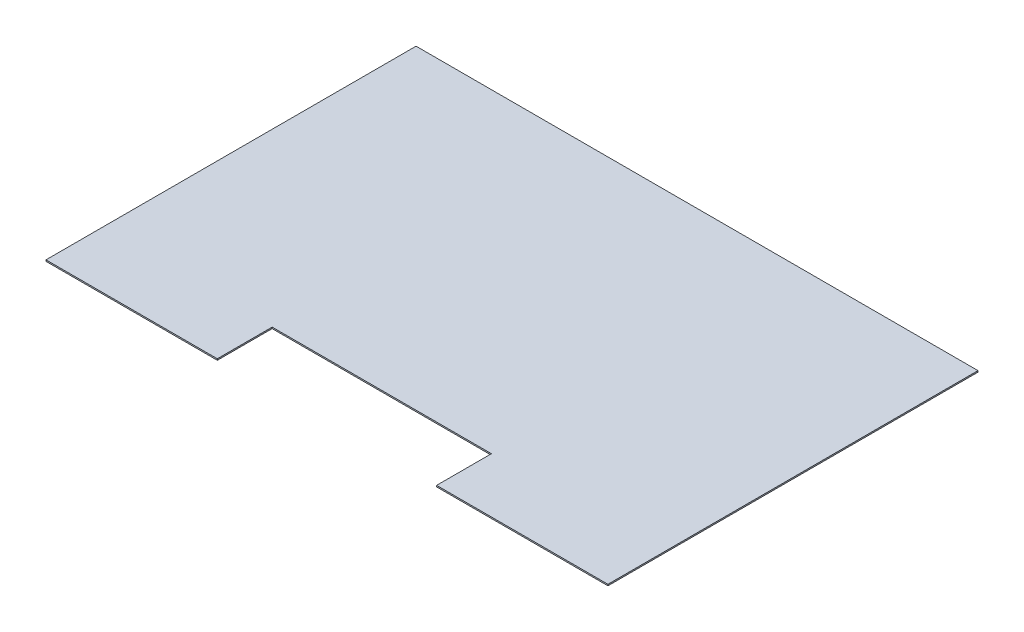
ISO-10303-21;
HEADER;
FILE_DESCRIPTION(('STEP AP214'),'2;1');
FILE_NAME('part.step','',(''),(''),'','','');
FILE_SCHEMA(('AUTOMOTIVE_DESIGN { 1 0 10303 214 1 1 1 1 }'));
ENDSEC;
DATA;
#1=APPLICATION_CONTEXT('core data for automotive mechanical design processes');
#2=APPLICATION_PROTOCOL_DEFINITION('international standard','automotive_design',2000,#1);
#3=PRODUCT_CONTEXT('',#1,'mechanical');
#4=PRODUCT('Part','Part','',(#3));
#5=PRODUCT_RELATED_PRODUCT_CATEGORY('part','',(#4));
#6=PRODUCT_DEFINITION_FORMATION('','',#4);
#7=PRODUCT_DEFINITION_CONTEXT('part definition',#1,'design');
#8=PRODUCT_DEFINITION('design','',#6,#7);
#9=PRODUCT_DEFINITION_SHAPE('','',#8);
#10=(LENGTH_UNIT() NAMED_UNIT(*) SI_UNIT(.MILLI.,.METRE.));
#11=(NAMED_UNIT(*) PLANE_ANGLE_UNIT() SI_UNIT($,.RADIAN.));
#12=(NAMED_UNIT(*) SI_UNIT($,.STERADIAN.) SOLID_ANGLE_UNIT());
#13=UNCERTAINTY_MEASURE_WITH_UNIT(LENGTH_MEASURE(1.E-05),#10,'distance_accuracy_value','');
#14=(GEOMETRIC_REPRESENTATION_CONTEXT(3) GLOBAL_UNCERTAINTY_ASSIGNED_CONTEXT((#13)) GLOBAL_UNIT_ASSIGNED_CONTEXT((#10,
#11,#12)) REPRESENTATION_CONTEXT('',''));
#15=CARTESIAN_POINT('',(0.,0.,0.));
#16=DIRECTION('',(0.,0.,1.));
#17=DIRECTION('',(1.,0.,0.));
#18=AXIS2_PLACEMENT_3D('',#15,#16,#17);
#19=CARTESIAN_POINT('',(80.,1.,0.));
#20=DIRECTION('',(-1.,0.,0.));
#21=DIRECTION('',(0.,0.,1.));
#22=AXIS2_PLACEMENT_3D('',#19,#20,#21);
#23=PLANE('',#22);
#24=DIRECTION('',(0.,0.,-1.));
#25=VECTOR('',#24,1.);
#26=CARTESIAN_POINT('',(80.,0.,0.));
#27=LINE('',#26,#25);
#28=CARTESIAN_POINT('',(80.,0.,135.));
#29=VERTEX_POINT('',#28);
#30=CARTESIAN_POINT('',(80.,0.,95.));
#31=VERTEX_POINT('',#30);
#32=EDGE_CURVE('E146',#29,#31,#27,.T.);
#33=ORIENTED_EDGE('',*,*,#32,.F.);
#34=DIRECTION('',(0.,-1.,0.));
#35=VECTOR('',#34,1.);
#36=CARTESIAN_POINT('',(80.,1.,135.));
#37=LINE('',#36,#35);
#38=CARTESIAN_POINT('',(80.,1.,135.));
#39=VERTEX_POINT('',#38);
#40=EDGE_CURVE('E11',#39,#29,#37,.T.);
#41=ORIENTED_EDGE('',*,*,#40,.F.);
#42=DIRECTION('',(0.,0.,-1.));
#43=VECTOR('',#42,1.);
#44=CARTESIAN_POINT('',(80.,1.,0.));
#45=LINE('',#44,#43);
#46=CARTESIAN_POINT('',(80.,1.,95.));
#47=VERTEX_POINT('',#46);
#48=EDGE_CURVE('E170',#39,#47,#45,.T.);
#49=ORIENTED_EDGE('',*,*,#48,.T.);
#50=DIRECTION('',(0.,-1.,0.));
#51=VECTOR('',#50,1.);
#52=CARTESIAN_POINT('',(80.,1.,95.));
#53=LINE('',#52,#51);
#54=EDGE_CURVE('E97',#47,#31,#53,.T.);
#55=ORIENTED_EDGE('',*,*,#54,.T.);
#56=EDGE_LOOP('',(#33,#41,#49,#55));
#57=FACE_BOUND('',#56,.T.);
#58=ADVANCED_FACE('F45',(#57),#23,.T.);
#59=CARTESIAN_POINT('',(0.,1.,135.));
#60=DIRECTION('',(0.,0.,-1.));
#61=DIRECTION('',(-1.,0.,0.));
#62=AXIS2_PLACEMENT_3D('',#59,#60,#61);
#63=PLANE('',#62);
#64=DIRECTION('',(1.,0.,0.));
#65=VECTOR('',#64,1.);
#66=CARTESIAN_POINT('',(0.,0.,135.));
#67=LINE('',#66,#65);
#68=CARTESIAN_POINT('',(205.,0.,135.));
#69=VERTEX_POINT('',#68);
#70=EDGE_CURVE('E150',#29,#69,#67,.T.);
#71=ORIENTED_EDGE('',*,*,#70,.T.);
#72=DIRECTION('',(0.,-1.,0.));
#73=VECTOR('',#72,1.);
#74=CARTESIAN_POINT('',(205.,1.,135.));
#75=LINE('',#74,#73);
#76=CARTESIAN_POINT('',(205.,1.,135.));
#77=VERTEX_POINT('',#76);
#78=EDGE_CURVE('E54',#77,#69,#75,.T.);
#79=ORIENTED_EDGE('',*,*,#78,.F.);
#80=DIRECTION('',(1.,0.,0.));
#81=VECTOR('',#80,1.);
#82=CARTESIAN_POINT('',(0.,1.,135.));
#83=LINE('',#82,#81);
#84=EDGE_CURVE('E129',#39,#77,#83,.T.);
#85=ORIENTED_EDGE('',*,*,#84,.F.);
#86=ORIENTED_EDGE('',*,*,#40,.T.);
#87=EDGE_LOOP('',(#71,#79,#85,#86));
#88=FACE_BOUND('',#87,.T.);
#89=ADVANCED_FACE('F192',(#88),#63,.F.);
#90=CARTESIAN_POINT('',(205.,1.,0.));
#91=DIRECTION('',(1.,0.,0.));
#92=DIRECTION('',(0.,0.,-1.));
#93=AXIS2_PLACEMENT_3D('',#90,#91,#92);
#94=PLANE('',#93);
#95=DIRECTION('',(0.,0.,1.));
#96=VECTOR('',#95,1.);
#97=CARTESIAN_POINT('',(205.,0.,0.));
#98=LINE('',#97,#96);
#99=CARTESIAN_POINT('',(205.,0.,-135.));
#100=VERTEX_POINT('',#99);
#101=EDGE_CURVE('E154',#100,#69,#98,.T.);
#102=ORIENTED_EDGE('',*,*,#101,.F.);
#103=DIRECTION('',(0.,-1.,0.));
#104=VECTOR('',#103,1.);
#105=CARTESIAN_POINT('',(205.,1.,-135.));
#106=LINE('',#105,#104);
#107=CARTESIAN_POINT('',(205.,1.,-135.));
#108=VERTEX_POINT('',#107);
#109=EDGE_CURVE('E180',#108,#100,#106,.T.);
#110=ORIENTED_EDGE('',*,*,#109,.F.);
#111=DIRECTION('',(0.,0.,1.));
#112=VECTOR('',#111,1.);
#113=CARTESIAN_POINT('',(205.,1.,0.));
#114=LINE('',#113,#112);
#115=EDGE_CURVE('E189',#108,#77,#114,.T.);
#116=ORIENTED_EDGE('',*,*,#115,.T.);
#117=ORIENTED_EDGE('',*,*,#78,.T.);
#118=EDGE_LOOP('',(#102,#110,#116,#117));
#119=FACE_BOUND('',#118,.T.);
#120=ADVANCED_FACE('F187',(#119),#94,.T.);
#121=CARTESIAN_POINT('',(0.,1.,-135.));
#122=DIRECTION('',(0.,0.,-1.));
#123=DIRECTION('',(-1.,0.,0.));
#124=AXIS2_PLACEMENT_3D('',#121,#122,#123);
#125=PLANE('',#124);
#126=DIRECTION('',(1.,0.,0.));
#127=VECTOR('',#126,1.);
#128=CARTESIAN_POINT('',(0.,0.,-135.));
#129=LINE('',#128,#127);
#130=CARTESIAN_POINT('',(-205.,0.,-135.));
#131=VERTEX_POINT('',#130);
#132=EDGE_CURVE('E158',#131,#100,#129,.T.);
#133=ORIENTED_EDGE('',*,*,#132,.F.);
#134=DIRECTION('',(0.,-1.,0.));
#135=VECTOR('',#134,1.);
#136=CARTESIAN_POINT('',(-205.,1.,-135.));
#137=LINE('',#136,#135);
#138=CARTESIAN_POINT('',(-205.,1.,-135.));
#139=VERTEX_POINT('',#138);
#140=EDGE_CURVE('E177',#139,#131,#137,.T.);
#141=ORIENTED_EDGE('',*,*,#140,.F.);
#142=DIRECTION('',(1.,0.,0.));
#143=VECTOR('',#142,1.);
#144=CARTESIAN_POINT('',(0.,1.,-135.));
#145=LINE('',#144,#143);
#146=EDGE_CURVE('E200',#139,#108,#145,.T.);
#147=ORIENTED_EDGE('',*,*,#146,.T.);
#148=ORIENTED_EDGE('',*,*,#109,.T.);
#149=EDGE_LOOP('',(#133,#141,#147,#148));
#150=FACE_BOUND('',#149,.T.);
#151=ADVANCED_FACE('F198',(#150),#125,.T.);
#152=CARTESIAN_POINT('',(-205.,1.,0.));
#153=DIRECTION('',(1.,0.,0.));
#154=DIRECTION('',(0.,0.,-1.));
#155=AXIS2_PLACEMENT_3D('',#152,#153,#154);
#156=PLANE('',#155);
#157=DIRECTION('',(0.,0.,1.));
#158=VECTOR('',#157,1.);
#159=CARTESIAN_POINT('',(-205.,0.,0.));
#160=LINE('',#159,#158);
#161=CARTESIAN_POINT('',(-205.,0.,135.));
#162=VERTEX_POINT('',#161);
#163=EDGE_CURVE('E162',#131,#162,#160,.T.);
#164=ORIENTED_EDGE('',*,*,#163,.T.);
#165=DIRECTION('',(0.,-1.,0.));
#166=VECTOR('',#165,1.);
#167=CARTESIAN_POINT('',(-205.,1.,135.));
#168=LINE('',#167,#166);
#169=CARTESIAN_POINT('',(-205.,1.,135.));
#170=VERTEX_POINT('',#169);
#171=EDGE_CURVE('E135',#170,#162,#168,.T.);
#172=ORIENTED_EDGE('',*,*,#171,.F.);
#173=DIRECTION('',(0.,0.,1.));
#174=VECTOR('',#173,1.);
#175=CARTESIAN_POINT('',(-205.,1.,0.));
#176=LINE('',#175,#174);
#177=EDGE_CURVE('E123',#139,#170,#176,.T.);
#178=ORIENTED_EDGE('',*,*,#177,.F.);
#179=ORIENTED_EDGE('',*,*,#140,.T.);
#180=EDGE_LOOP('',(#164,#172,#178,#179));
#181=FACE_BOUND('',#180,.T.);
#182=ADVANCED_FACE('F218',(#181),#156,.F.);
#183=CARTESIAN_POINT('',(-80.,0.,135.));
#184=VERTEX_POINT('',#183);
#185=EDGE_CURVE('E133',#162,#184,#67,.T.);
#186=ORIENTED_EDGE('',*,*,#185,.T.);
#187=DIRECTION('',(0.,-1.,0.));
#188=VECTOR('',#187,1.);
#189=CARTESIAN_POINT('',(-80.,1.,135.));
#190=LINE('',#189,#188);
#191=CARTESIAN_POINT('',(-80.,1.,135.));
#192=VERTEX_POINT('',#191);
#193=EDGE_CURVE('E130',#192,#184,#190,.T.);
#194=ORIENTED_EDGE('',*,*,#193,.F.);
#195=EDGE_CURVE('E116',#170,#192,#83,.T.);
#196=ORIENTED_EDGE('',*,*,#195,.F.);
#197=ORIENTED_EDGE('',*,*,#171,.T.);
#198=EDGE_LOOP('',(#186,#194,#196,#197));
#199=FACE_BOUND('',#198,.T.);
#200=ADVANCED_FACE('F131',(#199),#63,.F.);
#201=CARTESIAN_POINT('',(-80.,1.,0.));
#202=DIRECTION('',(-1.,0.,0.));
#203=DIRECTION('',(0.,0.,1.));
#204=AXIS2_PLACEMENT_3D('',#201,#202,#203);
#205=PLANE('',#204);
#206=DIRECTION('',(0.,0.,-1.));
#207=VECTOR('',#206,1.);
#208=CARTESIAN_POINT('',(-80.,0.,0.));
#209=LINE('',#208,#207);
#210=CARTESIAN_POINT('',(-80.,0.,95.));
#211=VERTEX_POINT('',#210);
#212=EDGE_CURVE('E90',#184,#211,#209,.T.);
#213=ORIENTED_EDGE('',*,*,#212,.T.);
#214=DIRECTION('',(0.,-1.,0.));
#215=VECTOR('',#214,1.);
#216=CARTESIAN_POINT('',(-80.,1.,95.));
#217=LINE('',#216,#215);
#218=CARTESIAN_POINT('',(-80.,1.,95.));
#219=VERTEX_POINT('',#218);
#220=EDGE_CURVE('E136',#219,#211,#217,.T.);
#221=ORIENTED_EDGE('',*,*,#220,.F.);
#222=DIRECTION('',(0.,0.,-1.));
#223=VECTOR('',#222,1.);
#224=CARTESIAN_POINT('',(-80.,1.,0.));
#225=LINE('',#224,#223);
#226=EDGE_CURVE('E120',#192,#219,#225,.T.);
#227=ORIENTED_EDGE('',*,*,#226,.F.);
#228=ORIENTED_EDGE('',*,*,#193,.T.);
#229=EDGE_LOOP('',(#213,#221,#227,#228));
#230=FACE_BOUND('',#229,.T.);
#231=ADVANCED_FACE('F138',(#230),#205,.F.);
#232=CARTESIAN_POINT('',(0.,1.,95.));
#233=DIRECTION('',(0.,0.,-1.));
#234=DIRECTION('',(-1.,0.,0.));
#235=AXIS2_PLACEMENT_3D('',#232,#233,#234);
#236=PLANE('',#235);
#237=DIRECTION('',(1.,0.,0.));
#238=VECTOR('',#237,1.);
#239=CARTESIAN_POINT('',(0.,0.,95.));
#240=LINE('',#239,#238);
#241=EDGE_CURVE('E167',#211,#31,#240,.T.);
#242=ORIENTED_EDGE('',*,*,#241,.T.);
#243=ORIENTED_EDGE('',*,*,#54,.F.);
#244=DIRECTION('',(1.,0.,0.));
#245=VECTOR('',#244,1.);
#246=CARTESIAN_POINT('',(0.,1.,95.));
#247=LINE('',#246,#245);
#248=EDGE_CURVE('E62',#219,#47,#247,.T.);
#249=ORIENTED_EDGE('',*,*,#248,.F.);
#250=ORIENTED_EDGE('',*,*,#220,.T.);
#251=EDGE_LOOP('',(#242,#243,#249,#250));
#252=FACE_BOUND('',#251,.T.);
#253=ADVANCED_FACE('F223',(#252),#236,.F.);
#254=CARTESIAN_POINT('',(0.,1.,0.));
#255=DIRECTION('',(0.,1.,0.));
#256=DIRECTION('',(0.,0.,1.));
#257=AXIS2_PLACEMENT_3D('',#254,#255,#256);
#258=PLANE('',#257);
#259=ORIENTED_EDGE('',*,*,#48,.F.);
#260=ORIENTED_EDGE('',*,*,#84,.T.);
#261=ORIENTED_EDGE('',*,*,#115,.F.);
#262=ORIENTED_EDGE('',*,*,#146,.F.);
#263=ORIENTED_EDGE('',*,*,#177,.T.);
#264=ORIENTED_EDGE('',*,*,#195,.T.);
#265=ORIENTED_EDGE('',*,*,#226,.T.);
#266=ORIENTED_EDGE('',*,*,#248,.T.);
#267=EDGE_LOOP('',(#259,#260,#261,#262,#263,#264,#265,#266));
#268=FACE_BOUND('',#267,.T.);
#269=ADVANCED_FACE('F118',(#268),#258,.T.);
#270=CARTESIAN_POINT('',(0.,0.,0.));
#271=DIRECTION('',(0.,1.,0.));
#272=DIRECTION('',(0.,0.,1.));
#273=AXIS2_PLACEMENT_3D('',#270,#271,#272);
#274=PLANE('',#273);
#275=ORIENTED_EDGE('',*,*,#32,.T.);
#276=ORIENTED_EDGE('',*,*,#241,.F.);
#277=ORIENTED_EDGE('',*,*,#212,.F.);
#278=ORIENTED_EDGE('',*,*,#185,.F.);
#279=ORIENTED_EDGE('',*,*,#163,.F.);
#280=ORIENTED_EDGE('',*,*,#132,.T.);
#281=ORIENTED_EDGE('',*,*,#101,.T.);
#282=ORIENTED_EDGE('',*,*,#70,.F.);
#283=EDGE_LOOP('',(#275,#276,#277,#278,#279,#280,#281,#282));
#284=FACE_BOUND('',#283,.T.);
#285=ADVANCED_FACE('F194',(#284),#274,.F.);
#286=CLOSED_SHELL('',(#58,#89,#120,#151,#182,#200,#231,#253,#269,#285));
#287=MANIFOLD_SOLID_BREP('B2',#286);
#288=ADVANCED_BREP_SHAPE_REPRESENTATION('',(#18,#287),#14);
#289=SHAPE_DEFINITION_REPRESENTATION(#9,#288);
ENDSEC;
END-ISO-10303-21;
